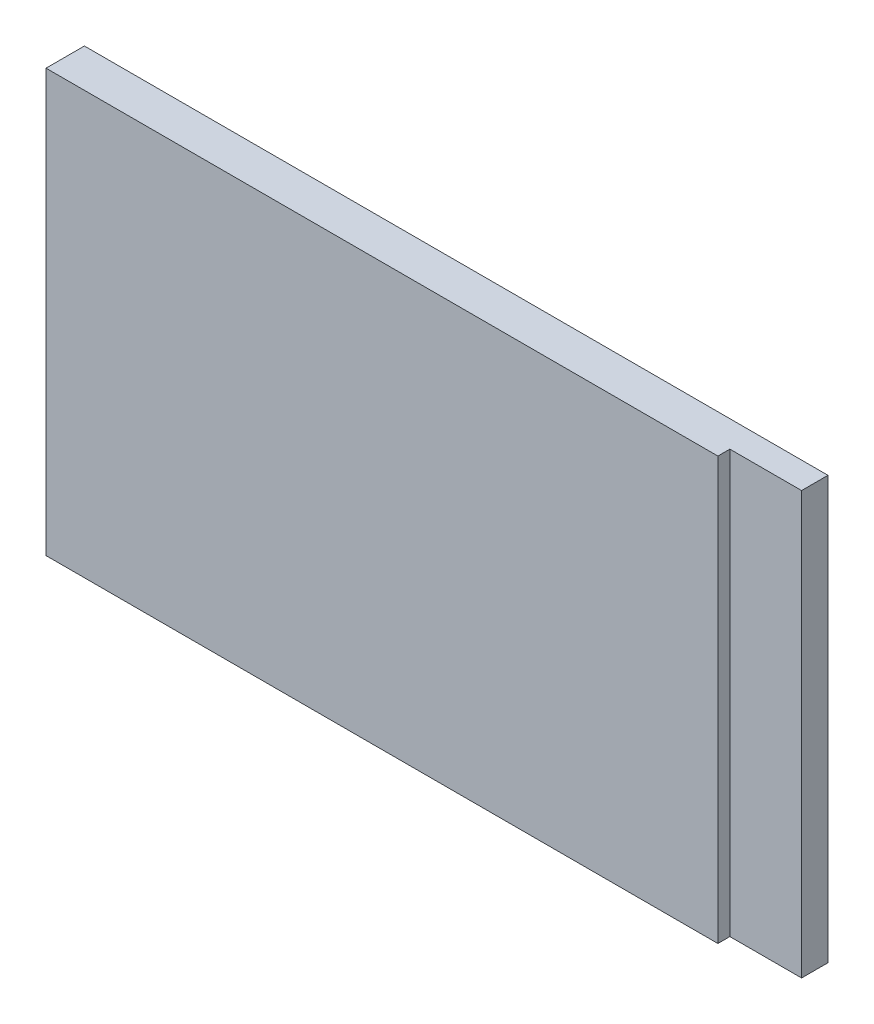
ISO-10303-21;
HEADER;
FILE_DESCRIPTION(('STEP AP214'),'2;1');
FILE_NAME('part.step','',(''),(''),'','','');
FILE_SCHEMA(('AUTOMOTIVE_DESIGN { 1 0 10303 214 1 1 1 1 }'));
ENDSEC;
DATA;
#1=APPLICATION_CONTEXT('core data for automotive mechanical design processes');
#2=APPLICATION_PROTOCOL_DEFINITION('international standard','automotive_design',2000,#1);
#3=PRODUCT_CONTEXT('',#1,'mechanical');
#4=PRODUCT('Part','Part','',(#3));
#5=PRODUCT_RELATED_PRODUCT_CATEGORY('part','',(#4));
#6=PRODUCT_DEFINITION_FORMATION('','',#4);
#7=PRODUCT_DEFINITION_CONTEXT('part definition',#1,'design');
#8=PRODUCT_DEFINITION('design','',#6,#7);
#9=PRODUCT_DEFINITION_SHAPE('','',#8);
#10=(LENGTH_UNIT() NAMED_UNIT(*) SI_UNIT(.MILLI.,.METRE.));
#11=(NAMED_UNIT(*) PLANE_ANGLE_UNIT() SI_UNIT($,.RADIAN.));
#12=(NAMED_UNIT(*) SI_UNIT($,.STERADIAN.) SOLID_ANGLE_UNIT());
#13=UNCERTAINTY_MEASURE_WITH_UNIT(LENGTH_MEASURE(1.E-05),#10,'distance_accuracy_value','');
#14=(GEOMETRIC_REPRESENTATION_CONTEXT(3) GLOBAL_UNCERTAINTY_ASSIGNED_CONTEXT((#13)) GLOBAL_UNIT_ASSIGNED_CONTEXT((#10,
#11,#12)) REPRESENTATION_CONTEXT('',''));
#15=CARTESIAN_POINT('',(0.,0.,0.));
#16=DIRECTION('',(0.,0.,1.));
#17=DIRECTION('',(1.,0.,0.));
#18=AXIS2_PLACEMENT_3D('',#15,#16,#17);
#19=CARTESIAN_POINT('',(15.5,8.8,1.6));
#20=DIRECTION('',(1.,0.,0.));
#21=DIRECTION('',(0.,1.,0.));
#22=AXIS2_PLACEMENT_3D('',#19,#20,#21);
#23=PLANE('',#22);
#24=DIRECTION('',(0.,0.,-1.));
#25=VECTOR('',#24,1.);
#26=CARTESIAN_POINT('',(15.5,8.8,1.6));
#27=LINE('',#26,#25);
#28=CARTESIAN_POINT('',(15.5,8.8,1.1));
#29=VERTEX_POINT('',#28);
#30=CARTESIAN_POINT('',(15.5,8.8,0.));
#31=VERTEX_POINT('',#30);
#32=EDGE_CURVE('E93',#29,#31,#27,.T.);
#33=ORIENTED_EDGE('',*,*,#32,.F.);
#34=DIRECTION('',(0.,-1.,0.));
#35=VECTOR('',#34,1.);
#36=CARTESIAN_POINT('',(15.5,8.8,1.1));
#37=LINE('',#36,#35);
#38=CARTESIAN_POINT('',(15.5,-8.8,1.1));
#39=VERTEX_POINT('',#38);
#40=EDGE_CURVE('E127',#29,#39,#37,.T.);
#41=ORIENTED_EDGE('',*,*,#40,.T.);
#42=DIRECTION('',(0.,0.,-1.));
#43=VECTOR('',#42,1.);
#44=CARTESIAN_POINT('',(15.5,-8.8,1.6));
#45=LINE('',#44,#43);
#46=CARTESIAN_POINT('',(15.5,-8.8,0.));
#47=VERTEX_POINT('',#46);
#48=EDGE_CURVE('E52',#39,#47,#45,.T.);
#49=ORIENTED_EDGE('',*,*,#48,.T.);
#50=DIRECTION('',(0.,-1.,0.));
#51=VECTOR('',#50,1.);
#52=CARTESIAN_POINT('',(15.5,8.8,0.));
#53=LINE('',#52,#51);
#54=EDGE_CURVE('E111',#31,#47,#53,.T.);
#55=ORIENTED_EDGE('',*,*,#54,.F.);
#56=EDGE_LOOP('',(#33,#41,#49,#55));
#57=FACE_BOUND('',#56,.T.);
#58=ADVANCED_FACE('F43',(#57),#23,.T.);
#59=CARTESIAN_POINT('',(-15.5,8.8,1.6));
#60=DIRECTION('',(1.,0.,0.));
#61=DIRECTION('',(0.,0.,-1.));
#62=AXIS2_PLACEMENT_3D('',#59,#60,#61);
#63=PLANE('',#62);
#64=DIRECTION('',(0.,-1.,0.));
#65=VECTOR('',#64,1.);
#66=CARTESIAN_POINT('',(-15.5,8.8,0.));
#67=LINE('',#66,#65);
#68=CARTESIAN_POINT('',(-15.5,8.8,0.));
#69=VERTEX_POINT('',#68);
#70=CARTESIAN_POINT('',(-15.5,-8.8,0.));
#71=VERTEX_POINT('',#70);
#72=EDGE_CURVE('E88',#69,#71,#67,.T.);
#73=ORIENTED_EDGE('',*,*,#72,.T.);
#74=DIRECTION('',(0.,0.,-1.));
#75=VECTOR('',#74,1.);
#76=CARTESIAN_POINT('',(-15.5,-8.8,1.6));
#77=LINE('',#76,#75);
#78=CARTESIAN_POINT('',(-15.5,-8.8,1.6));
#79=VERTEX_POINT('',#78);
#80=EDGE_CURVE('E11',#79,#71,#77,.T.);
#81=ORIENTED_EDGE('',*,*,#80,.F.);
#82=DIRECTION('',(0.,-1.,0.));
#83=VECTOR('',#82,1.);
#84=CARTESIAN_POINT('',(-15.5,8.8,1.6));
#85=LINE('',#84,#83);
#86=CARTESIAN_POINT('',(-15.5,8.8,1.6));
#87=VERTEX_POINT('',#86);
#88=EDGE_CURVE('E90',#87,#79,#85,.T.);
#89=ORIENTED_EDGE('',*,*,#88,.F.);
#90=DIRECTION('',(0.,0.,-1.));
#91=VECTOR('',#90,1.);
#92=CARTESIAN_POINT('',(-15.5,8.8,1.6));
#93=LINE('',#92,#91);
#94=EDGE_CURVE('E68',#87,#69,#93,.T.);
#95=ORIENTED_EDGE('',*,*,#94,.T.);
#96=EDGE_LOOP('',(#73,#81,#89,#95));
#97=FACE_BOUND('',#96,.T.);
#98=ADVANCED_FACE('F45',(#97),#63,.F.);
#99=CARTESIAN_POINT('',(-15.5,-8.8,1.6));
#100=DIRECTION('',(0.,1.,0.));
#101=DIRECTION('',(0.,0.,1.));
#102=AXIS2_PLACEMENT_3D('',#99,#100,#101);
#103=PLANE('',#102);
#104=DIRECTION('',(-1.,0.,0.));
#105=VECTOR('',#104,1.);
#106=CARTESIAN_POINT('',(15.5,-8.8,1.1));
#107=LINE('',#106,#105);
#108=CARTESIAN_POINT('',(12.51,-8.8,1.1));
#109=VERTEX_POINT('',#108);
#110=EDGE_CURVE('E149',#39,#109,#107,.T.);
#111=ORIENTED_EDGE('',*,*,#110,.T.);
#112=DIRECTION('',(0.,0.,1.));
#113=VECTOR('',#112,1.);
#114=CARTESIAN_POINT('',(12.51,-8.8,1.1));
#115=LINE('',#114,#113);
#116=CARTESIAN_POINT('',(12.51,-8.8,1.6));
#117=VERTEX_POINT('',#116);
#118=EDGE_CURVE('E104',#109,#117,#115,.T.);
#119=ORIENTED_EDGE('',*,*,#118,.T.);
#120=DIRECTION('',(1.,0.,0.));
#121=VECTOR('',#120,1.);
#122=CARTESIAN_POINT('',(-15.5,-8.8,1.6));
#123=LINE('',#122,#121);
#124=EDGE_CURVE('E115',#79,#117,#123,.T.);
#125=ORIENTED_EDGE('',*,*,#124,.F.);
#126=ORIENTED_EDGE('',*,*,#80,.T.);
#127=DIRECTION('',(1.,0.,0.));
#128=VECTOR('',#127,1.);
#129=CARTESIAN_POINT('',(-15.5,-8.8,0.));
#130=LINE('',#129,#128);
#131=EDGE_CURVE('E102',#71,#47,#130,.T.);
#132=ORIENTED_EDGE('',*,*,#131,.T.);
#133=ORIENTED_EDGE('',*,*,#48,.F.);
#134=EDGE_LOOP('',(#111,#119,#125,#126,#132,#133));
#135=FACE_BOUND('',#134,.T.);
#136=ADVANCED_FACE('F130',(#135),#103,.F.);
#137=CARTESIAN_POINT('',(-15.5,8.8,1.6));
#138=DIRECTION('',(0.,1.,0.));
#139=DIRECTION('',(0.,0.,1.));
#140=AXIS2_PLACEMENT_3D('',#137,#138,#139);
#141=PLANE('',#140);
#142=DIRECTION('',(0.,0.,1.));
#143=VECTOR('',#142,1.);
#144=CARTESIAN_POINT('',(12.51,8.8,1.1));
#145=LINE('',#144,#143);
#146=CARTESIAN_POINT('',(12.51,8.8,1.1));
#147=VERTEX_POINT('',#146);
#148=CARTESIAN_POINT('',(12.51,8.8,1.6));
#149=VERTEX_POINT('',#148);
#150=EDGE_CURVE('E59',#147,#149,#145,.T.);
#151=ORIENTED_EDGE('',*,*,#150,.F.);
#152=DIRECTION('',(-1.,0.,0.));
#153=VECTOR('',#152,1.);
#154=CARTESIAN_POINT('',(15.5,8.8,1.1));
#155=LINE('',#154,#153);
#156=EDGE_CURVE('E146',#29,#147,#155,.T.);
#157=ORIENTED_EDGE('',*,*,#156,.F.);
#158=ORIENTED_EDGE('',*,*,#32,.T.);
#159=DIRECTION('',(1.,0.,0.));
#160=VECTOR('',#159,1.);
#161=CARTESIAN_POINT('',(-15.5,8.8,0.));
#162=LINE('',#161,#160);
#163=EDGE_CURVE('E100',#69,#31,#162,.T.);
#164=ORIENTED_EDGE('',*,*,#163,.F.);
#165=ORIENTED_EDGE('',*,*,#94,.F.);
#166=DIRECTION('',(1.,0.,0.));
#167=VECTOR('',#166,1.);
#168=CARTESIAN_POINT('',(-15.5,8.8,1.6));
#169=LINE('',#168,#167);
#170=EDGE_CURVE('E94',#87,#149,#169,.T.);
#171=ORIENTED_EDGE('',*,*,#170,.T.);
#172=EDGE_LOOP('',(#151,#157,#158,#164,#165,#171));
#173=FACE_BOUND('',#172,.T.);
#174=ADVANCED_FACE('F106',(#173),#141,.T.);
#175=CARTESIAN_POINT('',(0.,0.,1.6));
#176=DIRECTION('',(0.,0.,1.));
#177=DIRECTION('',(1.,0.,0.));
#178=AXIS2_PLACEMENT_3D('',#175,#176,#177);
#179=PLANE('',#178);
#180=DIRECTION('',(0.,-1.,0.));
#181=VECTOR('',#180,1.);
#182=CARTESIAN_POINT('',(12.51,8.8,1.6));
#183=LINE('',#182,#181);
#184=EDGE_CURVE('E143',#149,#117,#183,.T.);
#185=ORIENTED_EDGE('',*,*,#184,.F.);
#186=ORIENTED_EDGE('',*,*,#170,.F.);
#187=ORIENTED_EDGE('',*,*,#88,.T.);
#188=ORIENTED_EDGE('',*,*,#124,.T.);
#189=EDGE_LOOP('',(#185,#186,#187,#188));
#190=FACE_BOUND('',#189,.T.);
#191=ADVANCED_FACE('F166',(#190),#179,.T.);
#192=CARTESIAN_POINT('',(0.,0.,0.));
#193=DIRECTION('',(0.,0.,1.));
#194=DIRECTION('',(1.,0.,0.));
#195=AXIS2_PLACEMENT_3D('',#192,#193,#194);
#196=PLANE('',#195);
#197=ORIENTED_EDGE('',*,*,#72,.F.);
#198=ORIENTED_EDGE('',*,*,#163,.T.);
#199=ORIENTED_EDGE('',*,*,#54,.T.);
#200=ORIENTED_EDGE('',*,*,#131,.F.);
#201=EDGE_LOOP('',(#197,#198,#199,#200));
#202=FACE_BOUND('',#201,.T.);
#203=ADVANCED_FACE('F98',(#202),#196,.F.);
#204=CARTESIAN_POINT('',(12.51,8.8,1.1));
#205=DIRECTION('',(-1.,0.,0.));
#206=DIRECTION('',(0.,-1.,0.));
#207=AXIS2_PLACEMENT_3D('',#204,#205,#206);
#208=PLANE('',#207);
#209=ORIENTED_EDGE('',*,*,#184,.T.);
#210=ORIENTED_EDGE('',*,*,#118,.F.);
#211=DIRECTION('',(0.,-1.,0.));
#212=VECTOR('',#211,1.);
#213=CARTESIAN_POINT('',(12.51,8.8,1.1));
#214=LINE('',#213,#212);
#215=EDGE_CURVE('E152',#147,#109,#214,.T.);
#216=ORIENTED_EDGE('',*,*,#215,.F.);
#217=ORIENTED_EDGE('',*,*,#150,.T.);
#218=EDGE_LOOP('',(#209,#210,#216,#217));
#219=FACE_BOUND('',#218,.T.);
#220=ADVANCED_FACE('F168',(#219),#208,.F.);
#221=CARTESIAN_POINT('',(0.,0.,1.1));
#222=DIRECTION('',(0.,0.,1.));
#223=DIRECTION('',(1.,0.,0.));
#224=AXIS2_PLACEMENT_3D('',#221,#222,#223);
#225=PLANE('',#224);
#226=ORIENTED_EDGE('',*,*,#156,.T.);
#227=ORIENTED_EDGE('',*,*,#215,.T.);
#228=ORIENTED_EDGE('',*,*,#110,.F.);
#229=ORIENTED_EDGE('',*,*,#40,.F.);
#230=EDGE_LOOP('',(#226,#227,#228,#229));
#231=FACE_BOUND('',#230,.T.);
#232=ADVANCED_FACE('F160',(#231),#225,.T.);
#233=CLOSED_SHELL('',(#58,#98,#136,#174,#191,#203,#220,#232));
#234=MANIFOLD_SOLID_BREP('B2',#233);
#235=ADVANCED_BREP_SHAPE_REPRESENTATION('',(#18,#234),#14);
#236=SHAPE_DEFINITION_REPRESENTATION(#9,#235);
ENDSEC;
END-ISO-10303-21;
